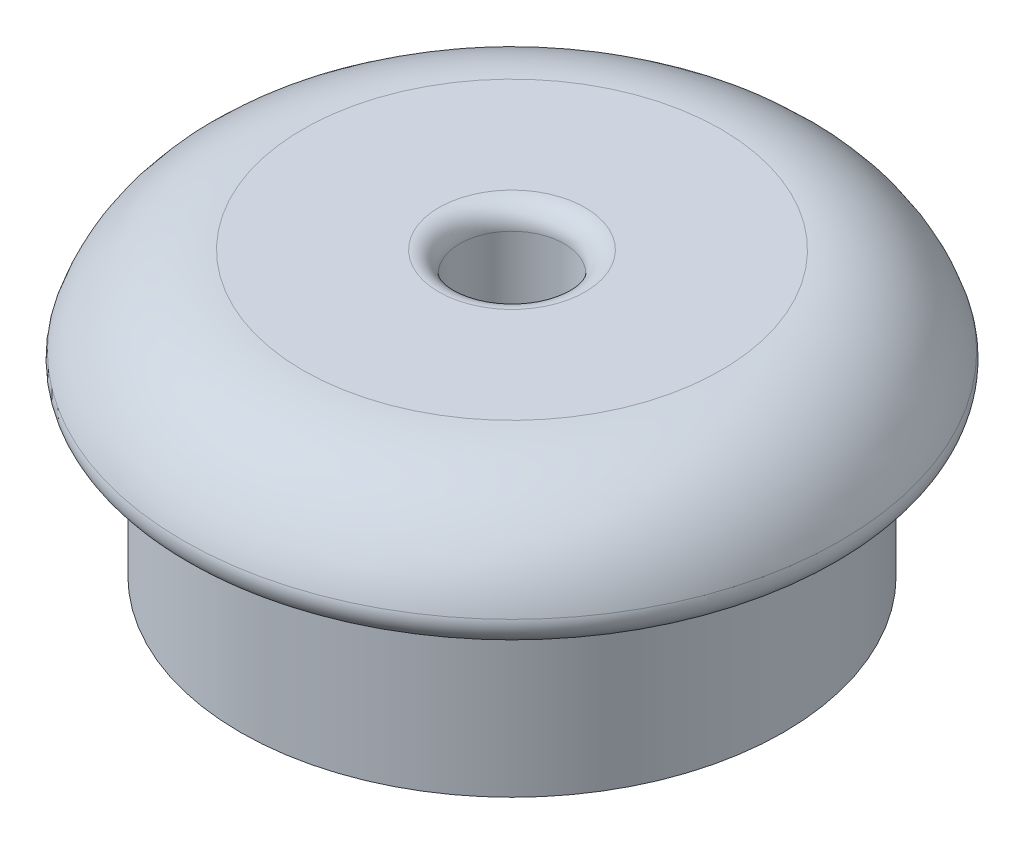
ISO-10303-21;
HEADER;
FILE_DESCRIPTION(('STEP AP214'),'2;1');
FILE_NAME('part.step','',(''),(''),'','','');
FILE_SCHEMA(('AUTOMOTIVE_DESIGN { 1 0 10303 214 1 1 1 1 }'));
ENDSEC;
DATA;
#1=APPLICATION_CONTEXT('core data for automotive mechanical design processes');
#2=APPLICATION_PROTOCOL_DEFINITION('international standard','automotive_design',2000,#1);
#3=PRODUCT_CONTEXT('',#1,'mechanical');
#4=PRODUCT('Part','Part','',(#3));
#5=PRODUCT_RELATED_PRODUCT_CATEGORY('part','',(#4));
#6=PRODUCT_DEFINITION_FORMATION('','',#4);
#7=PRODUCT_DEFINITION_CONTEXT('part definition',#1,'design');
#8=PRODUCT_DEFINITION('design','',#6,#7);
#9=PRODUCT_DEFINITION_SHAPE('','',#8);
#10=(LENGTH_UNIT() NAMED_UNIT(*) SI_UNIT(.MILLI.,.METRE.));
#11=(NAMED_UNIT(*) PLANE_ANGLE_UNIT() SI_UNIT($,.RADIAN.));
#12=(NAMED_UNIT(*) SI_UNIT($,.STERADIAN.) SOLID_ANGLE_UNIT());
#13=UNCERTAINTY_MEASURE_WITH_UNIT(LENGTH_MEASURE(1.E-05),#10,'distance_accuracy_value','');
#14=(GEOMETRIC_REPRESENTATION_CONTEXT(3) GLOBAL_UNCERTAINTY_ASSIGNED_CONTEXT((#13)) GLOBAL_UNIT_ASSIGNED_CONTEXT((#10,
#11,#12)) REPRESENTATION_CONTEXT('',''));
#15=CARTESIAN_POINT('',(0.,0.,0.));
#16=DIRECTION('',(0.,0.,1.));
#17=DIRECTION('',(1.,0.,0.));
#18=AXIS2_PLACEMENT_3D('',#15,#16,#17);
#19=CARTESIAN_POINT('',(0.,0.,0.));
#20=DIRECTION('',(0.,-1.,0.));
#21=DIRECTION('',(0.,0.,-1.));
#22=AXIS2_PLACEMENT_3D('',#19,#20,#21);
#23=PLANE('',#22);
#24=CARTESIAN_POINT('',(0.,0.,0.));
#25=DIRECTION('',(0.,-1.,0.));
#26=DIRECTION('',(0.,0.,-1.));
#27=AXIS2_PLACEMENT_3D('',#24,#25,#26);
#28=CIRCLE('',#27,7.112);
#29=CARTESIAN_POINT('',(0.,0.,-7.112));
#30=VERTEX_POINT('',#29);
#31=EDGE_CURVE('E10',#30,#30,#28,.F.);
#32=ORIENTED_EDGE('',*,*,#31,.T.);
#33=EDGE_LOOP('',(#32));
#34=FACE_BOUND('',#33,.T.);
#35=CARTESIAN_POINT('',(0.,0.,0.));
#36=DIRECTION('',(0.,-1.,0.));
#37=DIRECTION('',(0.,0.,-1.));
#38=AXIS2_PLACEMENT_3D('',#35,#36,#37);
#39=CIRCLE('',#38,7.50300557159905);
#40=CARTESIAN_POINT('',(0.,0.,-7.50300557159905));
#41=VERTEX_POINT('',#40);
#42=EDGE_CURVE('E70',#41,#41,#39,.T.);
#43=ORIENTED_EDGE('',*,*,#42,.T.);
#44=EDGE_LOOP('',(#43));
#45=FACE_BOUND('',#44,.T.);
#46=ADVANCED_FACE('F32',(#34,#45),#23,.T.);
#47=CARTESIAN_POINT('',(0.,0.508,0.));
#48=DIRECTION('',(0.,-1.,0.));
#49=DIRECTION('',(0.,0.,-1.));
#50=AXIS2_PLACEMENT_3D('',#47,#48,#49);
#51=TOROIDAL_SURFACE('',#50,7.50300557159905,0.507999999999998);
#52=CARTESIAN_POINT('',(0.,0.660399999999999,0.));
#53=DIRECTION('',(0.,-1.,0.));
#54=DIRECTION('',(0.,0.,-1.));
#55=AXIS2_PLACEMENT_3D('',#52,#53,#54);
#56=CIRCLE('',#55,7.98760668591885);
#57=CARTESIAN_POINT('',(0.,0.660399999999999,-7.98760668591885));
#58=VERTEX_POINT('',#57);
#59=EDGE_CURVE('E73',#58,#58,#56,.T.);
#60=ORIENTED_EDGE('',*,*,#59,.T.);
#61=EDGE_LOOP('',(#60));
#62=FACE_BOUND('',#61,.T.);
#63=ORIENTED_EDGE('',*,*,#42,.F.);
#64=EDGE_LOOP('',(#63));
#65=FACE_BOUND('',#64,.T.);
#66=ADVANCED_FACE('F108',(#62,#65),#51,.T.);
#67=CARTESIAN_POINT('',(0.,-0.253999999999995,0.));
#68=DIRECTION('',(0.,-1.,0.));
#69=DIRECTION('',(0.,0.,-1.));
#70=AXIS2_PLACEMENT_3D('',#67,#68,#69);
#71=TOROIDAL_SURFACE('',#70,5.08,3.048);
#72=CARTESIAN_POINT('',(0.,2.794,0.));
#73=DIRECTION('',(0.,-1.,0.));
#74=DIRECTION('',(0.,0.,-1.));
#75=AXIS2_PLACEMENT_3D('',#72,#73,#74);
#76=CIRCLE('',#75,5.08);
#77=CARTESIAN_POINT('',(0.,2.794,-5.08));
#78=VERTEX_POINT('',#77);
#79=EDGE_CURVE('E76',#78,#78,#76,.T.);
#80=ORIENTED_EDGE('',*,*,#79,.T.);
#81=EDGE_LOOP('',(#80));
#82=FACE_BOUND('',#81,.T.);
#83=ORIENTED_EDGE('',*,*,#59,.F.);
#84=EDGE_LOOP('',(#83));
#85=FACE_BOUND('',#84,.T.);
#86=ADVANCED_FACE('F113',(#82,#85),#71,.T.);
#87=CARTESIAN_POINT('',(5.08,2.794,0.));
#88=DIRECTION('',(0.,1.,0.));
#89=DIRECTION('',(0.,0.,1.));
#90=AXIS2_PLACEMENT_3D('',#87,#88,#89);
#91=PLANE('',#90);
#92=CARTESIAN_POINT('',(0.,2.794,0.));
#93=DIRECTION('',(0.,1.,0.));
#94=DIRECTION('',(0.,0.,1.));
#95=AXIS2_PLACEMENT_3D('',#92,#93,#94);
#96=CIRCLE('',#95,1.778);
#97=CARTESIAN_POINT('',(0.,2.794,1.778));
#98=VERTEX_POINT('',#97);
#99=EDGE_CURVE('E58',#98,#98,#96,.F.);
#100=ORIENTED_EDGE('',*,*,#99,.T.);
#101=EDGE_LOOP('',(#100));
#102=FACE_BOUND('',#101,.T.);
#103=ORIENTED_EDGE('',*,*,#79,.F.);
#104=EDGE_LOOP('',(#103));
#105=FACE_BOUND('',#104,.T.);
#106=ADVANCED_FACE('F153',(#102,#105),#91,.T.);
#107=CARTESIAN_POINT('',(0.,-4.064,0.));
#108=DIRECTION('',(0.,1.,0.));
#109=DIRECTION('',(0.,0.,1.));
#110=AXIS2_PLACEMENT_3D('',#107,#108,#109);
#111=CYLINDRICAL_SURFACE('',#110,6.604);
#112=CARTESIAN_POINT('',(0.,-0.508,0.));
#113=DIRECTION('',(0.,-1.,0.));
#114=DIRECTION('',(0.,0.,-1.));
#115=AXIS2_PLACEMENT_3D('',#112,#113,#114);
#116=CIRCLE('',#115,6.604);
#117=CARTESIAN_POINT('',(0.,-0.508,-6.604));
#118=VERTEX_POINT('',#117);
#119=EDGE_CURVE('E39',#118,#118,#116,.T.);
#120=ORIENTED_EDGE('',*,*,#119,.T.);
#121=EDGE_LOOP('',(#120));
#122=FACE_BOUND('',#121,.T.);
#123=CARTESIAN_POINT('',(0.,-4.064,0.));
#124=DIRECTION('',(0.,-1.,0.));
#125=DIRECTION('',(0.,0.,-1.));
#126=AXIS2_PLACEMENT_3D('',#123,#124,#125);
#127=CIRCLE('',#126,6.604);
#128=CARTESIAN_POINT('',(0.,-4.064,-6.604));
#129=VERTEX_POINT('',#128);
#130=EDGE_CURVE('E79',#129,#129,#127,.T.);
#131=ORIENTED_EDGE('',*,*,#130,.F.);
#132=EDGE_LOOP('',(#131));
#133=FACE_BOUND('',#132,.T.);
#134=ADVANCED_FACE('F148',(#122,#133),#111,.T.);
#135=CARTESIAN_POINT('',(0.,-4.064,0.));
#136=DIRECTION('',(0.,-1.,0.));
#137=DIRECTION('',(0.,0.,-1.));
#138=AXIS2_PLACEMENT_3D('',#135,#136,#137);
#139=PLANE('',#138);
#140=CARTESIAN_POINT('',(0.,-4.064,0.));
#141=DIRECTION('',(0.,-1.,0.));
#142=DIRECTION('',(0.,0.,-1.));
#143=AXIS2_PLACEMENT_3D('',#140,#141,#142);
#144=CIRCLE('',#143,5.334);
#145=CARTESIAN_POINT('',(0.,-4.064,-5.334));
#146=VERTEX_POINT('',#145);
#147=EDGE_CURVE('E82',#146,#146,#144,.T.);
#148=ORIENTED_EDGE('',*,*,#147,.F.);
#149=EDGE_LOOP('',(#148));
#150=FACE_BOUND('',#149,.T.);
#151=ORIENTED_EDGE('',*,*,#130,.T.);
#152=EDGE_LOOP('',(#151));
#153=FACE_BOUND('',#152,.T.);
#154=ADVANCED_FACE('F102',(#150,#153),#139,.T.);
#155=CARTESIAN_POINT('',(0.,0.,0.));
#156=DIRECTION('',(0.,1.,0.));
#157=DIRECTION('',(0.,0.,1.));
#158=AXIS2_PLACEMENT_3D('',#155,#156,#157);
#159=PLANE('',#158);
#160=CARTESIAN_POINT('',(0.,0.,0.));
#161=DIRECTION('',(0.,1.,0.));
#162=DIRECTION('',(0.,0.,1.));
#163=AXIS2_PLACEMENT_3D('',#160,#161,#162);
#164=CIRCLE('',#163,4.826);
#165=CARTESIAN_POINT('',(0.,0.,4.826));
#166=VERTEX_POINT('',#165);
#167=EDGE_CURVE('E52',#166,#166,#164,.F.);
#168=ORIENTED_EDGE('',*,*,#167,.T.);
#169=EDGE_LOOP('',(#168));
#170=FACE_BOUND('',#169,.T.);
#171=CARTESIAN_POINT('',(0.,0.,0.));
#172=DIRECTION('',(0.,1.,0.));
#173=DIRECTION('',(0.,0.,1.));
#174=AXIS2_PLACEMENT_3D('',#171,#172,#173);
#175=CIRCLE('',#174,3.048);
#176=CARTESIAN_POINT('',(0.,0.,3.048));
#177=VERTEX_POINT('',#176);
#178=EDGE_CURVE('E55',#177,#177,#175,.T.);
#179=ORIENTED_EDGE('',*,*,#178,.T.);
#180=EDGE_LOOP('',(#179));
#181=FACE_BOUND('',#180,.T.);
#182=ADVANCED_FACE('F103',(#170,#181),#159,.F.);
#183=CARTESIAN_POINT('',(0.,15.0868302833962,0.));
#184=DIRECTION('',(0.,-1.,0.));
#185=DIRECTION('',(0.,0.,-1.));
#186=AXIS2_PLACEMENT_3D('',#183,#184,#185);
#187=CYLINDRICAL_SURFACE('',#186,5.334);
#188=CARTESIAN_POINT('',(0.,-0.508,0.));
#189=DIRECTION('',(0.,1.,0.));
#190=DIRECTION('',(0.,0.,1.));
#191=AXIS2_PLACEMENT_3D('',#188,#189,#190);
#192=CIRCLE('',#191,5.334);
#193=CARTESIAN_POINT('',(0.,-0.508000000000002,-5.334));
#194=VERTEX_POINT('',#193);
#195=EDGE_CURVE('E47',#194,#194,#192,.T.);
#196=CARTESIAN_POINT('',(0.,-0.508000000000002,-5.334));
#197=CARTESIAN_POINT('',(0.,-0.545041666666668,-5.334));
#198=CARTESIAN_POINT('',(0.,-0.582083333333334,-5.334));
#199=CARTESIAN_POINT('',(0.,-0.656166666666667,-5.334));
#200=CARTESIAN_POINT('',(0.,-0.693208333333333,-5.334));
#201=CARTESIAN_POINT('',(0.,-0.767291666666667,-5.334));
#202=CARTESIAN_POINT('',(0.,-0.804333333333333,-5.334));
#203=CARTESIAN_POINT('',(0.,-0.878416666666667,-5.334));
#204=CARTESIAN_POINT('',(0.,-0.915458333333334,-5.334));
#205=CARTESIAN_POINT('',(0.,-0.989541666666667,-5.334));
#206=CARTESIAN_POINT('',(0.,-1.02658333333333,-5.334));
#207=CARTESIAN_POINT('',(0.,-1.10066666666667,-5.334));
#208=CARTESIAN_POINT('',(0.,-1.13770833333333,-5.334));
#209=CARTESIAN_POINT('',(0.,-1.21179166666667,-5.334));
#210=CARTESIAN_POINT('',(0.,-1.24883333333333,-5.334));
#211=CARTESIAN_POINT('',(0.,-1.32291666666667,-5.334));
#212=CARTESIAN_POINT('',(0.,-1.35995833333333,-5.334));
#213=CARTESIAN_POINT('',(0.,-1.43404166666667,-5.334));
#214=CARTESIAN_POINT('',(0.,-1.47108333333333,-5.334));
#215=CARTESIAN_POINT('',(0.,-1.54516666666666,-5.334));
#216=CARTESIAN_POINT('',(0.,-1.58220833333333,-5.334));
#217=CARTESIAN_POINT('',(0.,-1.65629166666666,-5.334));
#218=CARTESIAN_POINT('',(0.,-1.69333333333333,-5.334));
#219=CARTESIAN_POINT('',(0.,-1.76741666666666,-5.334));
#220=CARTESIAN_POINT('',(0.,-1.80445833333333,-5.334));
#221=CARTESIAN_POINT('',(0.,-1.87854166666666,-5.334));
#222=CARTESIAN_POINT('',(0.,-1.91558333333333,-5.334));
#223=CARTESIAN_POINT('',(0.,-1.98966666666666,-5.334));
#224=CARTESIAN_POINT('',(0.,-2.02670833333333,-5.334));
#225=CARTESIAN_POINT('',(0.,-2.10079166666666,-5.334));
#226=CARTESIAN_POINT('',(0.,-2.13783333333333,-5.334));
#227=CARTESIAN_POINT('',(0.,-2.21191666666666,-5.334));
#228=CARTESIAN_POINT('',(0.,-2.24895833333333,-5.334));
#229=CARTESIAN_POINT('',(0.,-2.32304166666666,-5.334));
#230=CARTESIAN_POINT('',(0.,-2.36008333333333,-5.334));
#231=CARTESIAN_POINT('',(0.,-2.43416666666666,-5.334));
#232=CARTESIAN_POINT('',(0.,-2.47120833333333,-5.334));
#233=CARTESIAN_POINT('',(0.,-2.54529166666666,-5.334));
#234=CARTESIAN_POINT('',(0.,-2.58233333333333,-5.334));
#235=CARTESIAN_POINT('',(0.,-2.65641666666667,-5.334));
#236=CARTESIAN_POINT('',(0.,-2.69345833333333,-5.334));
#237=CARTESIAN_POINT('',(0.,-2.76754166666667,-5.334));
#238=CARTESIAN_POINT('',(0.,-2.80458333333333,-5.334));
#239=CARTESIAN_POINT('',(0.,-2.87866666666667,-5.334));
#240=CARTESIAN_POINT('',(0.,-2.91570833333333,-5.334));
#241=CARTESIAN_POINT('',(0.,-2.98979166666667,-5.334));
#242=CARTESIAN_POINT('',(0.,-3.02683333333333,-5.334));
#243=CARTESIAN_POINT('',(0.,-3.10091666666666,-5.334));
#244=CARTESIAN_POINT('',(0.,-3.13795833333333,-5.334));
#245=CARTESIAN_POINT('',(0.,-3.21204166666666,-5.334));
#246=CARTESIAN_POINT('',(0.,-3.24908333333333,-5.334));
#247=CARTESIAN_POINT('',(0.,-3.32316666666666,-5.334));
#248=CARTESIAN_POINT('',(0.,-3.36020833333333,-5.334));
#249=CARTESIAN_POINT('',(0.,-3.43429166666666,-5.334));
#250=CARTESIAN_POINT('',(0.,-3.47133333333333,-5.334));
#251=CARTESIAN_POINT('',(0.,-3.54541666666666,-5.334));
#252=CARTESIAN_POINT('',(0.,-3.58245833333333,-5.334));
#253=CARTESIAN_POINT('',(0.,-3.65654166666666,-5.334));
#254=CARTESIAN_POINT('',(0.,-3.69358333333333,-5.334));
#255=CARTESIAN_POINT('',(0.,-3.76766666666666,-5.334));
#256=CARTESIAN_POINT('',(0.,-3.80470833333333,-5.334));
#257=CARTESIAN_POINT('',(0.,-3.87879166666666,-5.334));
#258=CARTESIAN_POINT('',(0.,-3.91583333333333,-5.334));
#259=CARTESIAN_POINT('',(0.,-3.98991666666666,-5.334));
#260=CARTESIAN_POINT('',(0.,-4.02695833333333,-5.334));
#261=CARTESIAN_POINT('',(0.,-4.064,-5.334));
#262=B_SPLINE_CURVE_WITH_KNOTS('',3,(#196,#197,#198,#199,#200,#201,#202,#203,#204,#205,#206,
#207,#208,#209,#210,#211,#212,#213,#214,#215,#216,#217,#218,#219,#220,#221,#222,#223,#224,#225,
#226,#227,#228,#229,#230,#231,#232,#233,#234,#235,#236,#237,#238,#239,#240,#241,#242,#243,#244,
#245,#246,#247,#248,#249,#250,#251,#252,#253,#254,#255,#256,#257,#258,#259,#260,#261),
.UNSPECIFIED.,.F.,.F.,(4,2,2,2,2,2,2,2,2,2,2,2,2,2,2,2,2,2,2,2,2,2,2,2,2,2,2,2,2,2,2,2,4),(0.,
0.111124999999998,0.222249999999999,0.333374999999999,0.444499999999999,0.555624999999999,
0.666749999999999,0.777874999999999,0.888999999999999,1.000125,1.11125,1.222375,1.3335,1.444625,
1.55575,1.666875,1.778,1.889125,2.00025,2.111375,2.2225,2.333625,2.44475,2.555875,
2.66699999999999,2.778125,2.88924999999999,3.00037499999999,3.11149999999999,3.22262499999999,
3.33374999999999,3.44487499999999,3.55599999999999),.UNSPECIFIED.);
#263=EDGE_CURVE('BSEAM93',#194,#146,#262,.T.);
#264=ORIENTED_EDGE('',*,*,#195,.T.);
#265=ORIENTED_EDGE('',*,*,#147,.T.);
#266=ORIENTED_EDGE('',*,*,#263,.T.);
#267=ORIENTED_EDGE('',*,*,#263,.F.);
#268=EDGE_LOOP('',(#264,#266,#265,#267));
#269=FACE_BOUND('',#268,.T.);
#270=ADVANCED_FACE('F93',(#269),#187,.F.);
#271=CARTESIAN_POINT('',(0.,15.0868302833962,0.));
#272=DIRECTION('',(0.,-1.,0.));
#273=DIRECTION('',(0.,0.,-1.));
#274=AXIS2_PLACEMENT_3D('',#271,#272,#273);
#275=CYLINDRICAL_SURFACE('',#274,2.54);
#276=CARTESIAN_POINT('',(0.,-0.508,0.));
#277=DIRECTION('',(0.,1.,0.));
#278=DIRECTION('',(0.,0.,1.));
#279=AXIS2_PLACEMENT_3D('',#276,#277,#278);
#280=CIRCLE('',#279,2.54);
#281=CARTESIAN_POINT('',(0.,-0.508000000000002,-2.54));
#282=VERTEX_POINT('',#281);
#283=EDGE_CURVE('E43',#282,#282,#280,.F.);
#284=CARTESIAN_POINT('',(0.,-4.064,0.));
#285=DIRECTION('',(0.,-1.,0.));
#286=DIRECTION('',(0.,0.,-1.));
#287=AXIS2_PLACEMENT_3D('',#284,#285,#286);
#288=CIRCLE('',#287,2.54);
#289=CARTESIAN_POINT('',(0.,-4.064,-2.54));
#290=VERTEX_POINT('',#289);
#291=EDGE_CURVE('E85',#290,#290,#288,.T.);
#292=CARTESIAN_POINT('',(0.,-0.508000000000002,-2.54));
#293=CARTESIAN_POINT('',(0.,-0.545041666666668,-2.54));
#294=CARTESIAN_POINT('',(0.,-0.582083333333334,-2.54));
#295=CARTESIAN_POINT('',(0.,-0.656166666666667,-2.54));
#296=CARTESIAN_POINT('',(0.,-0.693208333333333,-2.54));
#297=CARTESIAN_POINT('',(0.,-0.767291666666667,-2.54));
#298=CARTESIAN_POINT('',(0.,-0.804333333333333,-2.54));
#299=CARTESIAN_POINT('',(0.,-0.878416666666667,-2.54));
#300=CARTESIAN_POINT('',(0.,-0.915458333333334,-2.54));
#301=CARTESIAN_POINT('',(0.,-0.989541666666667,-2.54));
#302=CARTESIAN_POINT('',(0.,-1.02658333333333,-2.54));
#303=CARTESIAN_POINT('',(0.,-1.10066666666667,-2.54));
#304=CARTESIAN_POINT('',(0.,-1.13770833333333,-2.54));
#305=CARTESIAN_POINT('',(0.,-1.21179166666667,-2.54));
#306=CARTESIAN_POINT('',(0.,-1.24883333333333,-2.54));
#307=CARTESIAN_POINT('',(0.,-1.32291666666667,-2.54));
#308=CARTESIAN_POINT('',(0.,-1.35995833333333,-2.54));
#309=CARTESIAN_POINT('',(0.,-1.43404166666667,-2.54));
#310=CARTESIAN_POINT('',(0.,-1.47108333333333,-2.54));
#311=CARTESIAN_POINT('',(0.,-1.54516666666666,-2.54));
#312=CARTESIAN_POINT('',(0.,-1.58220833333333,-2.54));
#313=CARTESIAN_POINT('',(0.,-1.65629166666666,-2.54));
#314=CARTESIAN_POINT('',(0.,-1.69333333333333,-2.54));
#315=CARTESIAN_POINT('',(0.,-1.76741666666666,-2.54));
#316=CARTESIAN_POINT('',(0.,-1.80445833333333,-2.54));
#317=CARTESIAN_POINT('',(0.,-1.87854166666666,-2.54));
#318=CARTESIAN_POINT('',(0.,-1.91558333333333,-2.54));
#319=CARTESIAN_POINT('',(0.,-1.98966666666666,-2.54));
#320=CARTESIAN_POINT('',(0.,-2.02670833333333,-2.54));
#321=CARTESIAN_POINT('',(0.,-2.10079166666666,-2.54));
#322=CARTESIAN_POINT('',(0.,-2.13783333333333,-2.54));
#323=CARTESIAN_POINT('',(0.,-2.21191666666666,-2.54));
#324=CARTESIAN_POINT('',(0.,-2.24895833333333,-2.54));
#325=CARTESIAN_POINT('',(0.,-2.32304166666666,-2.54));
#326=CARTESIAN_POINT('',(0.,-2.36008333333333,-2.54));
#327=CARTESIAN_POINT('',(0.,-2.43416666666666,-2.54));
#328=CARTESIAN_POINT('',(0.,-2.47120833333333,-2.54));
#329=CARTESIAN_POINT('',(0.,-2.54529166666666,-2.54));
#330=CARTESIAN_POINT('',(0.,-2.58233333333333,-2.54));
#331=CARTESIAN_POINT('',(0.,-2.65641666666667,-2.54));
#332=CARTESIAN_POINT('',(0.,-2.69345833333333,-2.54));
#333=CARTESIAN_POINT('',(0.,-2.76754166666667,-2.54));
#334=CARTESIAN_POINT('',(0.,-2.80458333333333,-2.54));
#335=CARTESIAN_POINT('',(0.,-2.87866666666667,-2.54));
#336=CARTESIAN_POINT('',(0.,-2.91570833333333,-2.54));
#337=CARTESIAN_POINT('',(0.,-2.98979166666667,-2.54));
#338=CARTESIAN_POINT('',(0.,-3.02683333333333,-2.54));
#339=CARTESIAN_POINT('',(0.,-3.10091666666666,-2.54));
#340=CARTESIAN_POINT('',(0.,-3.13795833333333,-2.54));
#341=CARTESIAN_POINT('',(0.,-3.21204166666666,-2.54));
#342=CARTESIAN_POINT('',(0.,-3.24908333333333,-2.54));
#343=CARTESIAN_POINT('',(0.,-3.32316666666666,-2.54));
#344=CARTESIAN_POINT('',(0.,-3.36020833333333,-2.54));
#345=CARTESIAN_POINT('',(0.,-3.43429166666666,-2.54));
#346=CARTESIAN_POINT('',(0.,-3.47133333333333,-2.54));
#347=CARTESIAN_POINT('',(0.,-3.54541666666666,-2.54));
#348=CARTESIAN_POINT('',(0.,-3.58245833333333,-2.54));
#349=CARTESIAN_POINT('',(0.,-3.65654166666666,-2.54));
#350=CARTESIAN_POINT('',(0.,-3.69358333333333,-2.54));
#351=CARTESIAN_POINT('',(0.,-3.76766666666666,-2.54));
#352=CARTESIAN_POINT('',(0.,-3.80470833333333,-2.54));
#353=CARTESIAN_POINT('',(0.,-3.87879166666666,-2.54));
#354=CARTESIAN_POINT('',(0.,-3.91583333333333,-2.54));
#355=CARTESIAN_POINT('',(0.,-3.98991666666666,-2.54));
#356=CARTESIAN_POINT('',(0.,-4.02695833333333,-2.54));
#357=CARTESIAN_POINT('',(0.,-4.064,-2.54));
#358=B_SPLINE_CURVE_WITH_KNOTS('',3,(#292,#293,#294,#295,#296,#297,#298,#299,#300,#301,#302,
#303,#304,#305,#306,#307,#308,#309,#310,#311,#312,#313,#314,#315,#316,#317,#318,#319,#320,#321,
#322,#323,#324,#325,#326,#327,#328,#329,#330,#331,#332,#333,#334,#335,#336,#337,#338,#339,#340,
#341,#342,#343,#344,#345,#346,#347,#348,#349,#350,#351,#352,#353,#354,#355,#356,#357),
.UNSPECIFIED.,.F.,.F.,(4,2,2,2,2,2,2,2,2,2,2,2,2,2,2,2,2,2,2,2,2,2,2,2,2,2,2,2,2,2,2,2,4),(0.,
0.111124999999998,0.222249999999999,0.333374999999999,0.444499999999999,0.555624999999999,
0.666749999999999,0.777874999999999,0.888999999999999,1.000125,1.11125,1.222375,1.3335,1.444625,
1.55575,1.666875,1.778,1.889125,2.00025,2.111375,2.2225,2.333625,2.44475,2.555875,
2.66699999999999,2.778125,2.88924999999999,3.00037499999999,3.11149999999999,3.22262499999999,
3.33374999999999,3.44487499999999,3.55599999999999),.UNSPECIFIED.);
#359=EDGE_CURVE('BSEAM91',#282,#290,#358,.T.);
#360=ORIENTED_EDGE('',*,*,#283,.T.);
#361=ORIENTED_EDGE('',*,*,#291,.F.);
#362=ORIENTED_EDGE('',*,*,#359,.T.);
#363=ORIENTED_EDGE('',*,*,#359,.F.);
#364=EDGE_LOOP('',(#360,#362,#361,#363));
#365=FACE_BOUND('',#364,.T.);
#366=ADVANCED_FACE('F91',(#365),#275,.T.);
#367=ORIENTED_EDGE('',*,*,#291,.T.);
#368=EDGE_LOOP('',(#367));
#369=FACE_BOUND('',#368,.T.);
#370=ADVANCED_FACE('F89',(#369),#139,.T.);
#371=CARTESIAN_POINT('',(0.,-2.794,0.));
#372=DIRECTION('',(0.,-1.,0.));
#373=DIRECTION('',(0.,0.,-1.));
#374=AXIS2_PLACEMENT_3D('',#371,#372,#373);
#375=PLANE('',#374);
#376=CARTESIAN_POINT('',(0.,-2.794,0.));
#377=DIRECTION('',(0.,-1.,0.));
#378=DIRECTION('',(0.,0.,-1.));
#379=AXIS2_PLACEMENT_3D('',#376,#377,#378);
#380=CIRCLE('',#379,0.762);
#381=CARTESIAN_POINT('',(0.,-2.794,-0.762));
#382=VERTEX_POINT('',#381);
#383=EDGE_CURVE('E67',#382,#382,#380,.F.);
#384=ORIENTED_EDGE('',*,*,#383,.T.);
#385=EDGE_LOOP('',(#384));
#386=FACE_BOUND('',#385,.T.);
#387=ADVANCED_FACE('F100',(#386),#375,.F.);
#388=CARTESIAN_POINT('',(0.,-7.65610244842766,0.));
#389=DIRECTION('',(0.,1.,0.));
#390=DIRECTION('',(0.,0.,1.));
#391=AXIS2_PLACEMENT_3D('',#388,#389,#390);
#392=CYLINDRICAL_SURFACE('',#391,1.27);
#393=CARTESIAN_POINT('',(0.,-2.286,0.));
#394=DIRECTION('',(0.,-1.,0.));
#395=DIRECTION('',(0.,0.,-1.));
#396=AXIS2_PLACEMENT_3D('',#393,#394,#395);
#397=CIRCLE('',#396,1.27);
#398=CARTESIAN_POINT('',(0.,-2.286,-1.27));
#399=VERTEX_POINT('',#398);
#400=EDGE_CURVE('E61',#399,#399,#397,.T.);
#401=ORIENTED_EDGE('',*,*,#400,.T.);
#402=EDGE_LOOP('',(#401));
#403=FACE_BOUND('',#402,.T.);
#404=CARTESIAN_POINT('',(0.,2.286,0.));
#405=DIRECTION('',(0.,1.,0.));
#406=DIRECTION('',(0.,0.,1.));
#407=AXIS2_PLACEMENT_3D('',#404,#405,#406);
#408=CIRCLE('',#407,1.27);
#409=CARTESIAN_POINT('',(0.,2.286,1.27));
#410=VERTEX_POINT('',#409);
#411=EDGE_CURVE('E64',#410,#410,#408,.T.);
#412=ORIENTED_EDGE('',*,*,#411,.T.);
#413=EDGE_LOOP('',(#412));
#414=FACE_BOUND('',#413,.T.);
#415=ADVANCED_FACE('F123',(#403,#414),#392,.F.);
#416=CARTESIAN_POINT('',(0.,-2.286,0.));
#417=DIRECTION('',(0.,-1.,0.));
#418=DIRECTION('',(0.,0.,-1.));
#419=AXIS2_PLACEMENT_3D('',#416,#417,#418);
#420=TOROIDAL_SURFACE('',#419,0.762,0.508);
#421=ORIENTED_EDGE('',*,*,#400,.F.);
#422=EDGE_LOOP('',(#421));
#423=FACE_BOUND('',#422,.T.);
#424=ORIENTED_EDGE('',*,*,#383,.F.);
#425=EDGE_LOOP('',(#424));
#426=FACE_BOUND('',#425,.T.);
#427=ADVANCED_FACE('F119',(#423,#426),#420,.F.);
#428=CARTESIAN_POINT('',(0.,2.286,0.));
#429=DIRECTION('',(0.,1.,0.));
#430=DIRECTION('',(0.,0.,1.));
#431=AXIS2_PLACEMENT_3D('',#428,#429,#430);
#432=TOROIDAL_SURFACE('',#431,1.778,0.508);
#433=ORIENTED_EDGE('',*,*,#99,.F.);
#434=EDGE_LOOP('',(#433));
#435=FACE_BOUND('',#434,.T.);
#436=ORIENTED_EDGE('',*,*,#411,.F.);
#437=EDGE_LOOP('',(#436));
#438=FACE_BOUND('',#437,.T.);
#439=ADVANCED_FACE('F122',(#435,#438),#432,.T.);
#440=CARTESIAN_POINT('',(0.,-0.508,0.));
#441=DIRECTION('',(0.,1.,0.));
#442=DIRECTION('',(0.,0.,1.));
#443=AXIS2_PLACEMENT_3D('',#440,#441,#442);
#444=TOROIDAL_SURFACE('',#443,4.826,0.508);
#445=ORIENTED_EDGE('',*,*,#195,.F.);
#446=EDGE_LOOP('',(#445));
#447=FACE_BOUND('',#446,.T.);
#448=ORIENTED_EDGE('',*,*,#167,.F.);
#449=EDGE_LOOP('',(#448));
#450=FACE_BOUND('',#449,.T.);
#451=ADVANCED_FACE('F127',(#447,#450),#444,.F.);
#452=CARTESIAN_POINT('',(0.,-0.508,0.));
#453=DIRECTION('',(0.,1.,0.));
#454=DIRECTION('',(0.,0.,1.));
#455=AXIS2_PLACEMENT_3D('',#452,#453,#454);
#456=TOROIDAL_SURFACE('',#455,3.048,0.508);
#457=ORIENTED_EDGE('',*,*,#178,.F.);
#458=EDGE_LOOP('',(#457));
#459=FACE_BOUND('',#458,.T.);
#460=ORIENTED_EDGE('',*,*,#283,.F.);
#461=EDGE_LOOP('',(#460));
#462=FACE_BOUND('',#461,.T.);
#463=ADVANCED_FACE('F130',(#459,#462),#456,.F.);
#464=CARTESIAN_POINT('',(0.,-0.508,0.));
#465=DIRECTION('',(0.,-1.,0.));
#466=DIRECTION('',(0.,0.,-1.));
#467=AXIS2_PLACEMENT_3D('',#464,#465,#466);
#468=TOROIDAL_SURFACE('',#467,7.112,0.508);
#469=ORIENTED_EDGE('',*,*,#31,.F.);
#470=EDGE_LOOP('',(#469));
#471=FACE_BOUND('',#470,.T.);
#472=ORIENTED_EDGE('',*,*,#119,.F.);
#473=EDGE_LOOP('',(#472));
#474=FACE_BOUND('',#473,.T.);
#475=ADVANCED_FACE('F34',(#471,#474),#468,.F.);
#476=CLOSED_SHELL('',(#46,#66,#86,#106,#134,#154,#182,#270,#366,#370,#387,#415,#427,#439,#451,
#463,#475));
#477=MANIFOLD_SOLID_BREP('B2',#476);
#478=ADVANCED_BREP_SHAPE_REPRESENTATION('',(#18,#477),#14);
#479=SHAPE_DEFINITION_REPRESENTATION(#9,#478);
ENDSEC;
END-ISO-10303-21;
